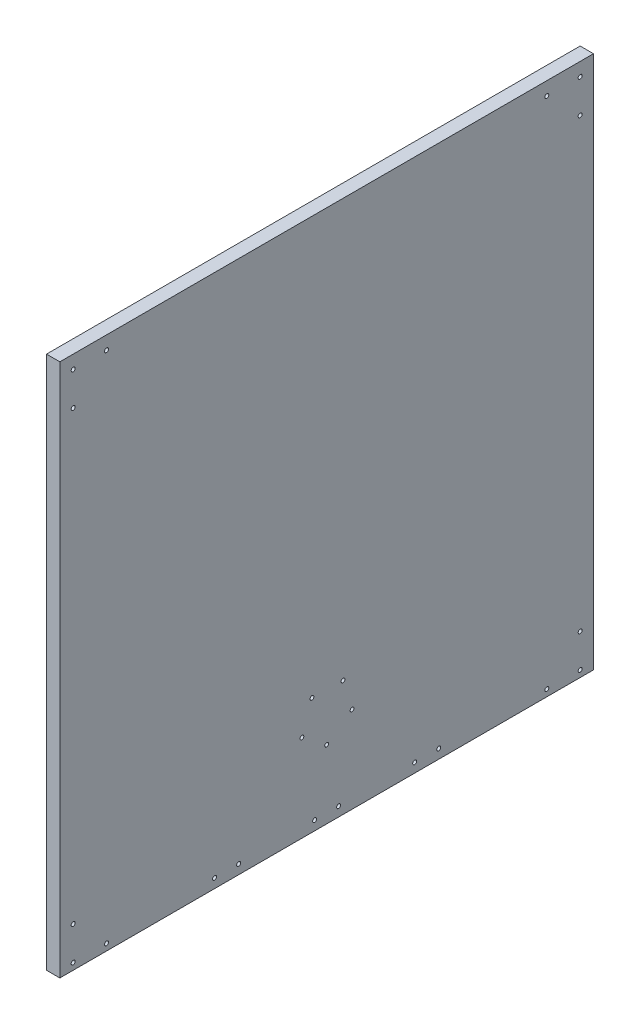
ISO-10303-21;
HEADER;
FILE_DESCRIPTION(('STEP AP214'),'2;1');
FILE_NAME('part.step','',(''),(''),'','','');
FILE_SCHEMA(('AUTOMOTIVE_DESIGN { 1 0 10303 214 1 1 1 1 }'));
ENDSEC;
DATA;
#1=APPLICATION_CONTEXT('core data for automotive mechanical design processes');
#2=APPLICATION_PROTOCOL_DEFINITION('international standard','automotive_design',2000,#1);
#3=PRODUCT_CONTEXT('',#1,'mechanical');
#4=PRODUCT('Part','Part','',(#3));
#5=PRODUCT_RELATED_PRODUCT_CATEGORY('part','',(#4));
#6=PRODUCT_DEFINITION_FORMATION('','',#4);
#7=PRODUCT_DEFINITION_CONTEXT('part definition',#1,'design');
#8=PRODUCT_DEFINITION('design','',#6,#7);
#9=PRODUCT_DEFINITION_SHAPE('','',#8);
#10=(LENGTH_UNIT() NAMED_UNIT(*) SI_UNIT(.MILLI.,.METRE.));
#11=(NAMED_UNIT(*) PLANE_ANGLE_UNIT() SI_UNIT($,.RADIAN.));
#12=(NAMED_UNIT(*) SI_UNIT($,.STERADIAN.) SOLID_ANGLE_UNIT());
#13=UNCERTAINTY_MEASURE_WITH_UNIT(LENGTH_MEASURE(1.E-05),#10,'distance_accuracy_value','');
#14=(GEOMETRIC_REPRESENTATION_CONTEXT(3) GLOBAL_UNCERTAINTY_ASSIGNED_CONTEXT((#13)) GLOBAL_UNIT_ASSIGNED_CONTEXT((#10,
#11,#12)) REPRESENTATION_CONTEXT('',''));
#15=CARTESIAN_POINT('',(0.,0.,0.));
#16=DIRECTION('',(0.,0.,1.));
#17=DIRECTION('',(1.,0.,0.));
#18=AXIS2_PLACEMENT_3D('',#15,#16,#17);
#19=CARTESIAN_POINT('',(10.,0.,-200.));
#20=DIRECTION('',(0.,0.,-1.));
#21=DIRECTION('',(0.,1.,0.));
#22=AXIS2_PLACEMENT_3D('',#19,#20,#21);
#23=PLANE('',#22);
#24=DIRECTION('',(0.,-1.,0.));
#25=VECTOR('',#24,1.);
#26=CARTESIAN_POINT('',(0.,0.,-200.));
#27=LINE('',#26,#25);
#28=CARTESIAN_POINT('',(0.,200.,-200.));
#29=VERTEX_POINT('',#28);
#30=CARTESIAN_POINT('',(0.,-200.,-200.));
#31=VERTEX_POINT('',#30);
#32=EDGE_CURVE('E100',#29,#31,#27,.T.);
#33=ORIENTED_EDGE('',*,*,#32,.F.);
#34=DIRECTION('',(-1.,0.,0.));
#35=VECTOR('',#34,1.);
#36=CARTESIAN_POINT('',(10.,200.,-200.));
#37=LINE('',#36,#35);
#38=CARTESIAN_POINT('',(10.,200.,-200.));
#39=VERTEX_POINT('',#38);
#40=EDGE_CURVE('E11',#39,#29,#37,.T.);
#41=ORIENTED_EDGE('',*,*,#40,.F.);
#42=DIRECTION('',(0.,-1.,0.));
#43=VECTOR('',#42,1.);
#44=CARTESIAN_POINT('',(10.,0.,-200.));
#45=LINE('',#44,#43);
#46=CARTESIAN_POINT('',(10.,-200.,-200.));
#47=VERTEX_POINT('',#46);
#48=EDGE_CURVE('E93',#39,#47,#45,.T.);
#49=ORIENTED_EDGE('',*,*,#48,.T.);
#50=DIRECTION('',(-1.,0.,0.));
#51=VECTOR('',#50,1.);
#52=CARTESIAN_POINT('',(10.,-200.,-200.));
#53=LINE('',#52,#51);
#54=EDGE_CURVE('E74',#47,#31,#53,.T.);
#55=ORIENTED_EDGE('',*,*,#54,.T.);
#56=EDGE_LOOP('',(#33,#41,#49,#55));
#57=FACE_BOUND('',#56,.T.);
#58=ADVANCED_FACE('F36',(#57),#23,.T.);
#59=CARTESIAN_POINT('',(10.,200.,0.));
#60=DIRECTION('',(0.,1.,0.));
#61=DIRECTION('',(0.,0.,1.));
#62=AXIS2_PLACEMENT_3D('',#59,#60,#61);
#63=PLANE('',#62);
#64=DIRECTION('',(0.,0.,-1.));
#65=VECTOR('',#64,1.);
#66=CARTESIAN_POINT('',(0.,200.,0.));
#67=LINE('',#66,#65);
#68=CARTESIAN_POINT('',(0.,200.,200.));
#69=VERTEX_POINT('',#68);
#70=EDGE_CURVE('E87',#69,#29,#67,.T.);
#71=ORIENTED_EDGE('',*,*,#70,.F.);
#72=DIRECTION('',(-1.,0.,0.));
#73=VECTOR('',#72,1.);
#74=CARTESIAN_POINT('',(10.,200.,200.));
#75=LINE('',#74,#73);
#76=CARTESIAN_POINT('',(10.,200.,200.));
#77=VERTEX_POINT('',#76);
#78=EDGE_CURVE('E44',#77,#69,#75,.T.);
#79=ORIENTED_EDGE('',*,*,#78,.F.);
#80=DIRECTION('',(0.,0.,-1.));
#81=VECTOR('',#80,1.);
#82=CARTESIAN_POINT('',(10.,200.,0.));
#83=LINE('',#82,#81);
#84=EDGE_CURVE('E85',#77,#39,#83,.T.);
#85=ORIENTED_EDGE('',*,*,#84,.T.);
#86=ORIENTED_EDGE('',*,*,#40,.T.);
#87=EDGE_LOOP('',(#71,#79,#85,#86));
#88=FACE_BOUND('',#87,.T.);
#89=ADVANCED_FACE('F83',(#88),#63,.T.);
#90=CARTESIAN_POINT('',(10.,0.,200.));
#91=DIRECTION('',(0.,0.,-1.));
#92=DIRECTION('',(0.,1.,0.));
#93=AXIS2_PLACEMENT_3D('',#90,#91,#92);
#94=PLANE('',#93);
#95=DIRECTION('',(0.,-1.,0.));
#96=VECTOR('',#95,1.);
#97=CARTESIAN_POINT('',(0.,0.,200.));
#98=LINE('',#97,#96);
#99=CARTESIAN_POINT('',(0.,-200.,200.));
#100=VERTEX_POINT('',#99);
#101=EDGE_CURVE('E67',#69,#100,#98,.T.);
#102=ORIENTED_EDGE('',*,*,#101,.T.);
#103=DIRECTION('',(-1.,0.,0.));
#104=VECTOR('',#103,1.);
#105=CARTESIAN_POINT('',(10.,-200.,200.));
#106=LINE('',#105,#104);
#107=CARTESIAN_POINT('',(10.,-200.,200.));
#108=VERTEX_POINT('',#107);
#109=EDGE_CURVE('E88',#108,#100,#106,.T.);
#110=ORIENTED_EDGE('',*,*,#109,.F.);
#111=DIRECTION('',(0.,-1.,0.));
#112=VECTOR('',#111,1.);
#113=CARTESIAN_POINT('',(10.,0.,200.));
#114=LINE('',#113,#112);
#115=EDGE_CURVE('E89',#77,#108,#114,.T.);
#116=ORIENTED_EDGE('',*,*,#115,.F.);
#117=ORIENTED_EDGE('',*,*,#78,.T.);
#118=EDGE_LOOP('',(#102,#110,#116,#117));
#119=FACE_BOUND('',#118,.T.);
#120=ADVANCED_FACE('F90',(#119),#94,.F.);
#121=CARTESIAN_POINT('',(10.,-200.,0.));
#122=DIRECTION('',(0.,1.,0.));
#123=DIRECTION('',(0.,0.,1.));
#124=AXIS2_PLACEMENT_3D('',#121,#122,#123);
#125=PLANE('',#124);
#126=DIRECTION('',(0.,0.,-1.));
#127=VECTOR('',#126,1.);
#128=CARTESIAN_POINT('',(0.,-200.,0.));
#129=LINE('',#128,#127);
#130=EDGE_CURVE('E95',#100,#31,#129,.T.);
#131=ORIENTED_EDGE('',*,*,#130,.T.);
#132=ORIENTED_EDGE('',*,*,#54,.F.);
#133=DIRECTION('',(0.,0.,-1.));
#134=VECTOR('',#133,1.);
#135=CARTESIAN_POINT('',(10.,-200.,0.));
#136=LINE('',#135,#134);
#137=EDGE_CURVE('E52',#108,#47,#136,.T.);
#138=ORIENTED_EDGE('',*,*,#137,.F.);
#139=ORIENTED_EDGE('',*,*,#109,.T.);
#140=EDGE_LOOP('',(#131,#132,#138,#139));
#141=FACE_BOUND('',#140,.T.);
#142=ADVANCED_FACE('F110',(#141),#125,.F.);
#143=CARTESIAN_POINT('',(10.,0.,0.));
#144=DIRECTION('',(1.,0.,0.));
#145=DIRECTION('',(0.,0.,-1.));
#146=AXIS2_PLACEMENT_3D('',#143,#144,#145);
#147=PLANE('',#146);
#148=CARTESIAN_POINT('',(10.,-113.022211572453,-12.2380282533939));
#149=DIRECTION('',(1.,0.,0.));
#150=DIRECTION('',(0.,0.,-1.));
#151=AXIS2_PLACEMENT_3D('',#148,#149,#150);
#152=CIRCLE('',#151,1.45000000000002);
#153=CARTESIAN_POINT('',(10.,-113.022211572453,-13.6880282533939));
#154=VERTEX_POINT('',#153);
#155=EDGE_CURVE('E245',#154,#154,#152,.T.);
#156=ORIENTED_EDGE('',*,*,#155,.F.);
#157=EDGE_LOOP('',(#156));
#158=FACE_BOUND('',#157,.T.);
#159=CARTESIAN_POINT('',(10.,-134.607193772722,18.571414113098));
#160=DIRECTION('',(1.,0.,0.));
#161=DIRECTION('',(0.,0.,-1.));
#162=AXIS2_PLACEMENT_3D('',#159,#160,#161);
#163=CIRCLE('',#162,1.44999999999999);
#164=CARTESIAN_POINT('',(10.,-134.607193772722,17.121414113098));
#165=VERTEX_POINT('',#164);
#166=EDGE_CURVE('E233',#165,#165,#163,.T.);
#167=ORIENTED_EDGE('',*,*,#166,.F.);
#168=EDGE_LOOP('',(#167));
#169=FACE_BOUND('',#168,.T.);
#170=CARTESIAN_POINT('',(10.,-135.253912203802,-19.0412825569231));
#171=DIRECTION('',(1.,0.,0.));
#172=DIRECTION('',(0.,0.,-1.));
#173=AXIS2_PLACEMENT_3D('',#170,#171,#172);
#174=CIRCLE('',#173,1.44999999999997);
#175=CARTESIAN_POINT('',(10.,-135.253912203802,-20.491282556923));
#176=VERTEX_POINT('',#175);
#177=EDGE_CURVE('E229',#176,#176,#174,.T.);
#178=ORIENTED_EDGE('',*,*,#177,.F.);
#179=EDGE_LOOP('',(#178));
#180=FACE_BOUND('',#179,.T.);
#181=CARTESIAN_POINT('',(10.,-148.59416485013,0.));
#182=DIRECTION('',(1.,0.,0.));
#183=DIRECTION('',(0.,0.,-1.));
#184=AXIS2_PLACEMENT_3D('',#181,#182,#183);
#185=CIRCLE('',#184,1.44999999999995);
#186=CARTESIAN_POINT('',(10.,-148.59416485013,-1.45000000000003));
#187=VERTEX_POINT('',#186);
#188=EDGE_CURVE('E236',#187,#187,#185,.T.);
#189=ORIENTED_EDGE('',*,*,#188,.F.);
#190=EDGE_LOOP('',(#189));
#191=FACE_BOUND('',#190,.T.);
#192=CARTESIAN_POINT('',(10.,-112.622517600894,11.0078966972191));
#193=DIRECTION('',(1.,0.,0.));
#194=DIRECTION('',(0.,0.,-1.));
#195=AXIS2_PLACEMENT_3D('',#192,#193,#194);
#196=CIRCLE('',#195,1.45000000000004);
#197=CARTESIAN_POINT('',(10.,-112.622517600894,9.55789669721902));
#198=VERTEX_POINT('',#197);
#199=EDGE_CURVE('E244',#198,#198,#196,.T.);
#200=ORIENTED_EDGE('',*,*,#199,.F.);
#201=EDGE_LOOP('',(#200));
#202=FACE_BOUND('',#201,.T.);
#203=CARTESIAN_POINT('',(10.,190.,165.));
#204=DIRECTION('',(-1.,0.,0.));
#205=DIRECTION('',(0.,0.,1.));
#206=AXIS2_PLACEMENT_3D('',#203,#204,#205);
#207=CIRCLE('',#206,1.5);
#208=CARTESIAN_POINT('',(10.,190.,166.5));
#209=VERTEX_POINT('',#208);
#210=EDGE_CURVE('E269',#209,#209,#207,.T.);
#211=ORIENTED_EDGE('',*,*,#210,.T.);
#212=EDGE_LOOP('',(#211));
#213=FACE_BOUND('',#212,.T.);
#214=CARTESIAN_POINT('',(10.,165.,190.));
#215=DIRECTION('',(-1.,0.,0.));
#216=DIRECTION('',(0.,0.,1.));
#217=AXIS2_PLACEMENT_3D('',#214,#215,#216);
#218=CIRCLE('',#217,1.5);
#219=CARTESIAN_POINT('',(10.,165.,191.5));
#220=VERTEX_POINT('',#219);
#221=EDGE_CURVE('E275',#220,#220,#218,.T.);
#222=ORIENTED_EDGE('',*,*,#221,.T.);
#223=EDGE_LOOP('',(#222));
#224=FACE_BOUND('',#223,.T.);
#225=CARTESIAN_POINT('',(10.,-195.,190.));
#226=DIRECTION('',(-1.,0.,0.));
#227=DIRECTION('',(0.,0.,1.));
#228=AXIS2_PLACEMENT_3D('',#225,#226,#227);
#229=CIRCLE('',#228,1.5);
#230=CARTESIAN_POINT('',(10.,-195.,191.5));
#231=VERTEX_POINT('',#230);
#232=EDGE_CURVE('E281',#231,#231,#229,.T.);
#233=ORIENTED_EDGE('',*,*,#232,.T.);
#234=EDGE_LOOP('',(#233));
#235=FACE_BOUND('',#234,.T.);
#236=CARTESIAN_POINT('',(10.,-195.,165.));
#237=DIRECTION('',(-1.,0.,0.));
#238=DIRECTION('',(0.,0.,1.));
#239=AXIS2_PLACEMENT_3D('',#236,#237,#238);
#240=CIRCLE('',#239,1.5);
#241=CARTESIAN_POINT('',(10.,-195.,166.5));
#242=VERTEX_POINT('',#241);
#243=EDGE_CURVE('E262',#242,#242,#240,.T.);
#244=ORIENTED_EDGE('',*,*,#243,.T.);
#245=EDGE_LOOP('',(#244));
#246=FACE_BOUND('',#245,.T.);
#247=CARTESIAN_POINT('',(10.,-170.,190.));
#248=DIRECTION('',(-1.,0.,0.));
#249=DIRECTION('',(0.,0.,1.));
#250=AXIS2_PLACEMENT_3D('',#247,#248,#249);
#251=CIRCLE('',#250,1.5);
#252=CARTESIAN_POINT('',(10.,-170.,191.5));
#253=VERTEX_POINT('',#252);
#254=EDGE_CURVE('E256',#253,#253,#251,.T.);
#255=ORIENTED_EDGE('',*,*,#254,.T.);
#256=EDGE_LOOP('',(#255));
#257=FACE_BOUND('',#256,.T.);
#258=CARTESIAN_POINT('',(10.,190.,190.));
#259=DIRECTION('',(-1.,0.,0.));
#260=DIRECTION('',(0.,0.,1.));
#261=AXIS2_PLACEMENT_3D('',#258,#259,#260);
#262=CIRCLE('',#261,1.5);
#263=CARTESIAN_POINT('',(10.,190.,191.5));
#264=VERTEX_POINT('',#263);
#265=EDGE_CURVE('E268',#264,#264,#262,.T.);
#266=ORIENTED_EDGE('',*,*,#265,.T.);
#267=EDGE_LOOP('',(#266));
#268=FACE_BOUND('',#267,.T.);
#269=CARTESIAN_POINT('',(10.,-193.,84.));
#270=DIRECTION('',(1.,0.,0.));
#271=DIRECTION('',(0.,0.,-1.));
#272=AXIS2_PLACEMENT_3D('',#269,#270,#271);
#273=CIRCLE('',#272,1.5);
#274=CARTESIAN_POINT('',(10.,-193.,82.5));
#275=VERTEX_POINT('',#274);
#276=EDGE_CURVE('E299',#275,#275,#273,.T.);
#277=ORIENTED_EDGE('',*,*,#276,.F.);
#278=EDGE_LOOP('',(#277));
#279=FACE_BOUND('',#278,.T.);
#280=CARTESIAN_POINT('',(10.,-193.,66.));
#281=DIRECTION('',(1.,0.,0.));
#282=DIRECTION('',(0.,0.,-1.));
#283=AXIS2_PLACEMENT_3D('',#280,#281,#282);
#284=CIRCLE('',#283,1.5);
#285=CARTESIAN_POINT('',(10.,-193.,64.5));
#286=VERTEX_POINT('',#285);
#287=EDGE_CURVE('E305',#286,#286,#284,.T.);
#288=ORIENTED_EDGE('',*,*,#287,.F.);
#289=EDGE_LOOP('',(#288));
#290=FACE_BOUND('',#289,.T.);
#291=CARTESIAN_POINT('',(10.,-193.,9.));
#292=DIRECTION('',(1.,0.,0.));
#293=DIRECTION('',(0.,0.,-1.));
#294=AXIS2_PLACEMENT_3D('',#291,#292,#293);
#295=CIRCLE('',#294,1.5);
#296=CARTESIAN_POINT('',(10.,-193.,7.5));
#297=VERTEX_POINT('',#296);
#298=EDGE_CURVE('E311',#297,#297,#295,.T.);
#299=ORIENTED_EDGE('',*,*,#298,.F.);
#300=EDGE_LOOP('',(#299));
#301=FACE_BOUND('',#300,.T.);
#302=CARTESIAN_POINT('',(10.,-193.,-9.));
#303=DIRECTION('',(1.,0.,0.));
#304=DIRECTION('',(0.,0.,-1.));
#305=AXIS2_PLACEMENT_3D('',#302,#303,#304);
#306=CIRCLE('',#305,1.5);
#307=CARTESIAN_POINT('',(10.,-193.,-10.5));
#308=VERTEX_POINT('',#307);
#309=EDGE_CURVE('E317',#308,#308,#306,.T.);
#310=ORIENTED_EDGE('',*,*,#309,.F.);
#311=EDGE_LOOP('',(#310));
#312=FACE_BOUND('',#311,.T.);
#313=CARTESIAN_POINT('',(10.,-193.,-66.));
#314=DIRECTION('',(1.,0.,0.));
#315=DIRECTION('',(0.,0.,-1.));
#316=AXIS2_PLACEMENT_3D('',#313,#314,#315);
#317=CIRCLE('',#316,1.5);
#318=CARTESIAN_POINT('',(10.,-193.,-67.5));
#319=VERTEX_POINT('',#318);
#320=EDGE_CURVE('E323',#319,#319,#317,.T.);
#321=ORIENTED_EDGE('',*,*,#320,.F.);
#322=EDGE_LOOP('',(#321));
#323=FACE_BOUND('',#322,.T.);
#324=CARTESIAN_POINT('',(10.,-193.,-84.));
#325=DIRECTION('',(1.,0.,0.));
#326=DIRECTION('',(0.,0.,-1.));
#327=AXIS2_PLACEMENT_3D('',#324,#325,#326);
#328=CIRCLE('',#327,1.5);
#329=CARTESIAN_POINT('',(10.,-193.,-85.5));
#330=VERTEX_POINT('',#329);
#331=EDGE_CURVE('E292',#330,#330,#328,.T.);
#332=ORIENTED_EDGE('',*,*,#331,.F.);
#333=EDGE_LOOP('',(#332));
#334=FACE_BOUND('',#333,.T.);
#335=CARTESIAN_POINT('',(10.,190.,-165.));
#336=DIRECTION('',(1.,0.,0.));
#337=DIRECTION('',(0.,0.,-1.));
#338=AXIS2_PLACEMENT_3D('',#335,#336,#337);
#339=CIRCLE('',#338,1.5);
#340=CARTESIAN_POINT('',(10.,190.,-166.5));
#341=VERTEX_POINT('',#340);
#342=EDGE_CURVE('E341',#341,#341,#339,.T.);
#343=ORIENTED_EDGE('',*,*,#342,.F.);
#344=EDGE_LOOP('',(#343));
#345=FACE_BOUND('',#344,.T.);
#346=CARTESIAN_POINT('',(10.,165.,-190.));
#347=DIRECTION('',(1.,0.,0.));
#348=DIRECTION('',(0.,0.,-1.));
#349=AXIS2_PLACEMENT_3D('',#346,#347,#348);
#350=CIRCLE('',#349,1.5);
#351=CARTESIAN_POINT('',(10.,165.,-191.5));
#352=VERTEX_POINT('',#351);
#353=EDGE_CURVE('E347',#352,#352,#350,.T.);
#354=ORIENTED_EDGE('',*,*,#353,.F.);
#355=EDGE_LOOP('',(#354));
#356=FACE_BOUND('',#355,.T.);
#357=CARTESIAN_POINT('',(10.,-195.,-190.));
#358=DIRECTION('',(1.,0.,0.));
#359=DIRECTION('',(0.,0.,-1.));
#360=AXIS2_PLACEMENT_3D('',#357,#358,#359);
#361=CIRCLE('',#360,1.5);
#362=CARTESIAN_POINT('',(10.,-195.,-191.5));
#363=VERTEX_POINT('',#362);
#364=EDGE_CURVE('E353',#363,#363,#361,.T.);
#365=ORIENTED_EDGE('',*,*,#364,.F.);
#366=EDGE_LOOP('',(#365));
#367=FACE_BOUND('',#366,.T.);
#368=CARTESIAN_POINT('',(10.,-195.,-165.));
#369=DIRECTION('',(1.,0.,0.));
#370=DIRECTION('',(0.,0.,-1.));
#371=AXIS2_PLACEMENT_3D('',#368,#369,#370);
#372=CIRCLE('',#371,1.5);
#373=CARTESIAN_POINT('',(10.,-195.,-166.5));
#374=VERTEX_POINT('',#373);
#375=EDGE_CURVE('E334',#374,#374,#372,.T.);
#376=ORIENTED_EDGE('',*,*,#375,.F.);
#377=EDGE_LOOP('',(#376));
#378=FACE_BOUND('',#377,.T.);
#379=CARTESIAN_POINT('',(10.,-170.,-190.));
#380=DIRECTION('',(1.,0.,0.));
#381=DIRECTION('',(0.,0.,-1.));
#382=AXIS2_PLACEMENT_3D('',#379,#380,#381);
#383=CIRCLE('',#382,1.5);
#384=CARTESIAN_POINT('',(10.,-170.,-191.5));
#385=VERTEX_POINT('',#384);
#386=EDGE_CURVE('E298',#385,#385,#383,.T.);
#387=ORIENTED_EDGE('',*,*,#386,.F.);
#388=EDGE_LOOP('',(#387));
#389=FACE_BOUND('',#388,.T.);
#390=CARTESIAN_POINT('',(10.,190.,-190.));
#391=DIRECTION('',(1.,0.,0.));
#392=DIRECTION('',(0.,0.,-1.));
#393=AXIS2_PLACEMENT_3D('',#390,#391,#392);
#394=CIRCLE('',#393,1.5);
#395=CARTESIAN_POINT('',(10.,190.,-191.5));
#396=VERTEX_POINT('',#395);
#397=EDGE_CURVE('E340',#396,#396,#394,.T.);
#398=ORIENTED_EDGE('',*,*,#397,.F.);
#399=EDGE_LOOP('',(#398));
#400=FACE_BOUND('',#399,.T.);
#401=ORIENTED_EDGE('',*,*,#48,.F.);
#402=ORIENTED_EDGE('',*,*,#84,.F.);
#403=ORIENTED_EDGE('',*,*,#115,.T.);
#404=ORIENTED_EDGE('',*,*,#137,.T.);
#405=EDGE_LOOP('',(#401,#402,#403,#404));
#406=FACE_BOUND('',#405,.T.);
#407=ADVANCED_FACE('F92',(#158,#169,#180,#191,#202,#213,#224,#235,#246,#257,#268,#279,#290,#301,
#312,#323,#334,#345,#356,#367,#378,#389,#400,#406),#147,.T.);
#408=CARTESIAN_POINT('',(0.,0.,0.));
#409=DIRECTION('',(1.,0.,0.));
#410=DIRECTION('',(0.,0.,-1.));
#411=AXIS2_PLACEMENT_3D('',#408,#409,#410);
#412=PLANE('',#411);
#413=CARTESIAN_POINT('',(0.,-113.022211572453,-12.2380282533939));
#414=DIRECTION('',(1.,0.,0.));
#415=DIRECTION('',(0.,0.,-1.));
#416=AXIS2_PLACEMENT_3D('',#413,#414,#415);
#417=CIRCLE('',#416,1.45000000000002);
#418=CARTESIAN_POINT('',(0.,-113.022211572453,-13.6880282533939));
#419=VERTEX_POINT('',#418);
#420=EDGE_CURVE('E241',#419,#419,#417,.T.);
#421=ORIENTED_EDGE('',*,*,#420,.T.);
#422=EDGE_LOOP('',(#421));
#423=FACE_BOUND('',#422,.T.);
#424=CARTESIAN_POINT('',(0.,-134.607193772722,18.571414113098));
#425=DIRECTION('',(1.,0.,0.));
#426=DIRECTION('',(0.,0.,-1.));
#427=AXIS2_PLACEMENT_3D('',#424,#425,#426);
#428=CIRCLE('',#427,1.44999999999999);
#429=CARTESIAN_POINT('',(0.,-134.607193772722,17.121414113098));
#430=VERTEX_POINT('',#429);
#431=EDGE_CURVE('E248',#430,#430,#428,.T.);
#432=ORIENTED_EDGE('',*,*,#431,.T.);
#433=EDGE_LOOP('',(#432));
#434=FACE_BOUND('',#433,.T.);
#435=CARTESIAN_POINT('',(0.,-135.253912203802,-19.0412825569231));
#436=DIRECTION('',(1.,0.,0.));
#437=DIRECTION('',(0.,0.,-1.));
#438=AXIS2_PLACEMENT_3D('',#435,#436,#437);
#439=CIRCLE('',#438,1.44999999999997);
#440=CARTESIAN_POINT('',(0.,-135.253912203802,-20.491282556923));
#441=VERTEX_POINT('',#440);
#442=EDGE_CURVE('E226',#441,#441,#439,.T.);
#443=ORIENTED_EDGE('',*,*,#442,.T.);
#444=EDGE_LOOP('',(#443));
#445=FACE_BOUND('',#444,.T.);
#446=CARTESIAN_POINT('',(0.,-148.59416485013,0.));
#447=DIRECTION('',(1.,0.,0.));
#448=DIRECTION('',(0.,0.,-1.));
#449=AXIS2_PLACEMENT_3D('',#446,#447,#448);
#450=CIRCLE('',#449,1.44999999999995);
#451=CARTESIAN_POINT('',(0.,-148.59416485013,-1.45000000000003));
#452=VERTEX_POINT('',#451);
#453=EDGE_CURVE('E231',#452,#452,#450,.T.);
#454=ORIENTED_EDGE('',*,*,#453,.T.);
#455=EDGE_LOOP('',(#454));
#456=FACE_BOUND('',#455,.T.);
#457=CARTESIAN_POINT('',(0.,-112.622517600894,11.0078966972191));
#458=DIRECTION('',(1.,0.,0.));
#459=DIRECTION('',(0.,0.,-1.));
#460=AXIS2_PLACEMENT_3D('',#457,#458,#459);
#461=CIRCLE('',#460,1.45000000000004);
#462=CARTESIAN_POINT('',(0.,-112.622517600894,9.55789669721902));
#463=VERTEX_POINT('',#462);
#464=EDGE_CURVE('E253',#463,#463,#461,.T.);
#465=ORIENTED_EDGE('',*,*,#464,.T.);
#466=EDGE_LOOP('',(#465));
#467=FACE_BOUND('',#466,.T.);
#468=CARTESIAN_POINT('',(0.,190.,165.));
#469=DIRECTION('',(-1.,0.,0.));
#470=DIRECTION('',(0.,0.,1.));
#471=AXIS2_PLACEMENT_3D('',#468,#469,#470);
#472=CIRCLE('',#471,1.5);
#473=CARTESIAN_POINT('',(0.,190.,166.5));
#474=VERTEX_POINT('',#473);
#475=EDGE_CURVE('E265',#474,#474,#472,.T.);
#476=ORIENTED_EDGE('',*,*,#475,.F.);
#477=EDGE_LOOP('',(#476));
#478=FACE_BOUND('',#477,.T.);
#479=CARTESIAN_POINT('',(0.,165.,190.));
#480=DIRECTION('',(-1.,0.,0.));
#481=DIRECTION('',(0.,0.,1.));
#482=AXIS2_PLACEMENT_3D('',#479,#480,#481);
#483=CIRCLE('',#482,1.5);
#484=CARTESIAN_POINT('',(0.,165.,191.5));
#485=VERTEX_POINT('',#484);
#486=EDGE_CURVE('E272',#485,#485,#483,.T.);
#487=ORIENTED_EDGE('',*,*,#486,.F.);
#488=EDGE_LOOP('',(#487));
#489=FACE_BOUND('',#488,.T.);
#490=CARTESIAN_POINT('',(0.,-195.,190.));
#491=DIRECTION('',(-1.,0.,0.));
#492=DIRECTION('',(0.,0.,1.));
#493=AXIS2_PLACEMENT_3D('',#490,#491,#492);
#494=CIRCLE('',#493,1.5);
#495=CARTESIAN_POINT('',(0.,-195.,191.5));
#496=VERTEX_POINT('',#495);
#497=EDGE_CURVE('E278',#496,#496,#494,.T.);
#498=ORIENTED_EDGE('',*,*,#497,.F.);
#499=EDGE_LOOP('',(#498));
#500=FACE_BOUND('',#499,.T.);
#501=CARTESIAN_POINT('',(0.,-195.,165.));
#502=DIRECTION('',(-1.,0.,0.));
#503=DIRECTION('',(0.,0.,1.));
#504=AXIS2_PLACEMENT_3D('',#501,#502,#503);
#505=CIRCLE('',#504,1.5);
#506=CARTESIAN_POINT('',(0.,-195.,166.5));
#507=VERTEX_POINT('',#506);
#508=EDGE_CURVE('E284',#507,#507,#505,.T.);
#509=ORIENTED_EDGE('',*,*,#508,.F.);
#510=EDGE_LOOP('',(#509));
#511=FACE_BOUND('',#510,.T.);
#512=CARTESIAN_POINT('',(0.,-170.,190.));
#513=DIRECTION('',(-1.,0.,0.));
#514=DIRECTION('',(0.,0.,1.));
#515=AXIS2_PLACEMENT_3D('',#512,#513,#514);
#516=CIRCLE('',#515,1.5);
#517=CARTESIAN_POINT('',(0.,-170.,191.5));
#518=VERTEX_POINT('',#517);
#519=EDGE_CURVE('E259',#518,#518,#516,.T.);
#520=ORIENTED_EDGE('',*,*,#519,.F.);
#521=EDGE_LOOP('',(#520));
#522=FACE_BOUND('',#521,.T.);
#523=CARTESIAN_POINT('',(0.,190.,190.));
#524=DIRECTION('',(-1.,0.,0.));
#525=DIRECTION('',(0.,0.,1.));
#526=AXIS2_PLACEMENT_3D('',#523,#524,#525);
#527=CIRCLE('',#526,1.5);
#528=CARTESIAN_POINT('',(0.,190.,191.5));
#529=VERTEX_POINT('',#528);
#530=EDGE_CURVE('E289',#529,#529,#527,.T.);
#531=ORIENTED_EDGE('',*,*,#530,.F.);
#532=EDGE_LOOP('',(#531));
#533=FACE_BOUND('',#532,.T.);
#534=CARTESIAN_POINT('',(0.,-193.,84.));
#535=DIRECTION('',(1.,0.,0.));
#536=DIRECTION('',(0.,0.,-1.));
#537=AXIS2_PLACEMENT_3D('',#534,#535,#536);
#538=CIRCLE('',#537,1.5);
#539=CARTESIAN_POINT('',(0.,-193.,82.5));
#540=VERTEX_POINT('',#539);
#541=EDGE_CURVE('E295',#540,#540,#538,.T.);
#542=ORIENTED_EDGE('',*,*,#541,.T.);
#543=EDGE_LOOP('',(#542));
#544=FACE_BOUND('',#543,.T.);
#545=CARTESIAN_POINT('',(0.,-193.,66.));
#546=DIRECTION('',(1.,0.,0.));
#547=DIRECTION('',(0.,0.,-1.));
#548=AXIS2_PLACEMENT_3D('',#545,#546,#547);
#549=CIRCLE('',#548,1.5);
#550=CARTESIAN_POINT('',(0.,-193.,64.5));
#551=VERTEX_POINT('',#550);
#552=EDGE_CURVE('E302',#551,#551,#549,.T.);
#553=ORIENTED_EDGE('',*,*,#552,.T.);
#554=EDGE_LOOP('',(#553));
#555=FACE_BOUND('',#554,.T.);
#556=CARTESIAN_POINT('',(0.,-193.,9.));
#557=DIRECTION('',(1.,0.,0.));
#558=DIRECTION('',(0.,0.,-1.));
#559=AXIS2_PLACEMENT_3D('',#556,#557,#558);
#560=CIRCLE('',#559,1.5);
#561=CARTESIAN_POINT('',(0.,-193.,7.5));
#562=VERTEX_POINT('',#561);
#563=EDGE_CURVE('E308',#562,#562,#560,.T.);
#564=ORIENTED_EDGE('',*,*,#563,.T.);
#565=EDGE_LOOP('',(#564));
#566=FACE_BOUND('',#565,.T.);
#567=CARTESIAN_POINT('',(0.,-193.,-9.));
#568=DIRECTION('',(1.,0.,0.));
#569=DIRECTION('',(0.,0.,-1.));
#570=AXIS2_PLACEMENT_3D('',#567,#568,#569);
#571=CIRCLE('',#570,1.5);
#572=CARTESIAN_POINT('',(0.,-193.,-10.5));
#573=VERTEX_POINT('',#572);
#574=EDGE_CURVE('E314',#573,#573,#571,.T.);
#575=ORIENTED_EDGE('',*,*,#574,.T.);
#576=EDGE_LOOP('',(#575));
#577=FACE_BOUND('',#576,.T.);
#578=CARTESIAN_POINT('',(0.,-193.,-66.));
#579=DIRECTION('',(1.,0.,0.));
#580=DIRECTION('',(0.,0.,-1.));
#581=AXIS2_PLACEMENT_3D('',#578,#579,#580);
#582=CIRCLE('',#581,1.5);
#583=CARTESIAN_POINT('',(0.,-193.,-67.5));
#584=VERTEX_POINT('',#583);
#585=EDGE_CURVE('E320',#584,#584,#582,.T.);
#586=ORIENTED_EDGE('',*,*,#585,.T.);
#587=EDGE_LOOP('',(#586));
#588=FACE_BOUND('',#587,.T.);
#589=CARTESIAN_POINT('',(0.,-193.,-84.));
#590=DIRECTION('',(1.,0.,0.));
#591=DIRECTION('',(0.,0.,-1.));
#592=AXIS2_PLACEMENT_3D('',#589,#590,#591);
#593=CIRCLE('',#592,1.5);
#594=CARTESIAN_POINT('',(0.,-193.,-85.5));
#595=VERTEX_POINT('',#594);
#596=EDGE_CURVE('E326',#595,#595,#593,.T.);
#597=ORIENTED_EDGE('',*,*,#596,.T.);
#598=EDGE_LOOP('',(#597));
#599=FACE_BOUND('',#598,.T.);
#600=CARTESIAN_POINT('',(0.,190.,-165.));
#601=DIRECTION('',(1.,0.,0.));
#602=DIRECTION('',(0.,0.,-1.));
#603=AXIS2_PLACEMENT_3D('',#600,#601,#602);
#604=CIRCLE('',#603,1.5);
#605=CARTESIAN_POINT('',(0.,190.,-166.5));
#606=VERTEX_POINT('',#605);
#607=EDGE_CURVE('E337',#606,#606,#604,.T.);
#608=ORIENTED_EDGE('',*,*,#607,.T.);
#609=EDGE_LOOP('',(#608));
#610=FACE_BOUND('',#609,.T.);
#611=CARTESIAN_POINT('',(0.,165.,-190.));
#612=DIRECTION('',(1.,0.,0.));
#613=DIRECTION('',(0.,0.,-1.));
#614=AXIS2_PLACEMENT_3D('',#611,#612,#613);
#615=CIRCLE('',#614,1.5);
#616=CARTESIAN_POINT('',(0.,165.,-191.5));
#617=VERTEX_POINT('',#616);
#618=EDGE_CURVE('E344',#617,#617,#615,.T.);
#619=ORIENTED_EDGE('',*,*,#618,.T.);
#620=EDGE_LOOP('',(#619));
#621=FACE_BOUND('',#620,.T.);
#622=CARTESIAN_POINT('',(0.,-195.,-190.));
#623=DIRECTION('',(1.,0.,0.));
#624=DIRECTION('',(0.,0.,-1.));
#625=AXIS2_PLACEMENT_3D('',#622,#623,#624);
#626=CIRCLE('',#625,1.5);
#627=CARTESIAN_POINT('',(0.,-195.,-191.5));
#628=VERTEX_POINT('',#627);
#629=EDGE_CURVE('E350',#628,#628,#626,.T.);
#630=ORIENTED_EDGE('',*,*,#629,.T.);
#631=EDGE_LOOP('',(#630));
#632=FACE_BOUND('',#631,.T.);
#633=CARTESIAN_POINT('',(0.,-195.,-165.));
#634=DIRECTION('',(1.,0.,0.));
#635=DIRECTION('',(0.,0.,-1.));
#636=AXIS2_PLACEMENT_3D('',#633,#634,#635);
#637=CIRCLE('',#636,1.5);
#638=CARTESIAN_POINT('',(0.,-195.,-166.5));
#639=VERTEX_POINT('',#638);
#640=EDGE_CURVE('E356',#639,#639,#637,.T.);
#641=ORIENTED_EDGE('',*,*,#640,.T.);
#642=EDGE_LOOP('',(#641));
#643=FACE_BOUND('',#642,.T.);
#644=CARTESIAN_POINT('',(0.,-170.,-190.));
#645=DIRECTION('',(1.,0.,0.));
#646=DIRECTION('',(0.,0.,-1.));
#647=AXIS2_PLACEMENT_3D('',#644,#645,#646);
#648=CIRCLE('',#647,1.5);
#649=CARTESIAN_POINT('',(0.,-170.,-191.5));
#650=VERTEX_POINT('',#649);
#651=EDGE_CURVE('E331',#650,#650,#648,.T.);
#652=ORIENTED_EDGE('',*,*,#651,.T.);
#653=EDGE_LOOP('',(#652));
#654=FACE_BOUND('',#653,.T.);
#655=CARTESIAN_POINT('',(0.,190.,-190.));
#656=DIRECTION('',(1.,0.,0.));
#657=DIRECTION('',(0.,0.,-1.));
#658=AXIS2_PLACEMENT_3D('',#655,#656,#657);
#659=CIRCLE('',#658,1.5);
#660=CARTESIAN_POINT('',(0.,190.,-191.5));
#661=VERTEX_POINT('',#660);
#662=EDGE_CURVE('E103',#661,#661,#659,.T.);
#663=ORIENTED_EDGE('',*,*,#662,.T.);
#664=EDGE_LOOP('',(#663));
#665=FACE_BOUND('',#664,.T.);
#666=ORIENTED_EDGE('',*,*,#32,.T.);
#667=ORIENTED_EDGE('',*,*,#130,.F.);
#668=ORIENTED_EDGE('',*,*,#101,.F.);
#669=ORIENTED_EDGE('',*,*,#70,.T.);
#670=EDGE_LOOP('',(#666,#667,#668,#669));
#671=FACE_BOUND('',#670,.T.);
#672=ADVANCED_FACE('F112',(#423,#434,#445,#456,#467,#478,#489,#500,#511,#522,#533,#544,#555,
#566,#577,#588,#599,#610,#621,#632,#643,#654,#665,#671),#412,.F.);
#673=CARTESIAN_POINT('',(0.,190.,-190.));
#674=DIRECTION('',(1.,0.,0.));
#675=DIRECTION('',(0.,0.,-1.));
#676=AXIS2_PLACEMENT_3D('',#673,#674,#675);
#677=CYLINDRICAL_SURFACE('',#676,1.5);
#678=ORIENTED_EDGE('',*,*,#662,.F.);
#679=EDGE_LOOP('',(#678));
#680=FACE_BOUND('',#679,.T.);
#681=ORIENTED_EDGE('',*,*,#397,.T.);
#682=EDGE_LOOP('',(#681));
#683=FACE_BOUND('',#682,.T.);
#684=ADVANCED_FACE('F126',(#680,#683),#677,.F.);
#685=CARTESIAN_POINT('',(0.,-170.,-190.));
#686=DIRECTION('',(1.,0.,0.));
#687=DIRECTION('',(0.,0.,-1.));
#688=AXIS2_PLACEMENT_3D('',#685,#686,#687);
#689=CYLINDRICAL_SURFACE('',#688,1.5);
#690=ORIENTED_EDGE('',*,*,#651,.F.);
#691=EDGE_LOOP('',(#690));
#692=FACE_BOUND('',#691,.T.);
#693=ORIENTED_EDGE('',*,*,#386,.T.);
#694=EDGE_LOOP('',(#693));
#695=FACE_BOUND('',#694,.T.);
#696=ADVANCED_FACE('F133',(#692,#695),#689,.F.);
#697=CARTESIAN_POINT('',(0.,-195.,-165.));
#698=DIRECTION('',(1.,0.,0.));
#699=DIRECTION('',(0.,0.,-1.));
#700=AXIS2_PLACEMENT_3D('',#697,#698,#699);
#701=CYLINDRICAL_SURFACE('',#700,1.5);
#702=ORIENTED_EDGE('',*,*,#640,.F.);
#703=EDGE_LOOP('',(#702));
#704=FACE_BOUND('',#703,.T.);
#705=ORIENTED_EDGE('',*,*,#375,.T.);
#706=EDGE_LOOP('',(#705));
#707=FACE_BOUND('',#706,.T.);
#708=ADVANCED_FACE('F135',(#704,#707),#701,.F.);
#709=CARTESIAN_POINT('',(0.,-195.,-190.));
#710=DIRECTION('',(1.,0.,0.));
#711=DIRECTION('',(0.,0.,-1.));
#712=AXIS2_PLACEMENT_3D('',#709,#710,#711);
#713=CYLINDRICAL_SURFACE('',#712,1.5);
#714=ORIENTED_EDGE('',*,*,#629,.F.);
#715=EDGE_LOOP('',(#714));
#716=FACE_BOUND('',#715,.T.);
#717=ORIENTED_EDGE('',*,*,#364,.T.);
#718=EDGE_LOOP('',(#717));
#719=FACE_BOUND('',#718,.T.);
#720=ADVANCED_FACE('F138',(#716,#719),#713,.F.);
#721=CARTESIAN_POINT('',(0.,165.,-190.));
#722=DIRECTION('',(1.,0.,0.));
#723=DIRECTION('',(0.,0.,-1.));
#724=AXIS2_PLACEMENT_3D('',#721,#722,#723);
#725=CYLINDRICAL_SURFACE('',#724,1.5);
#726=ORIENTED_EDGE('',*,*,#618,.F.);
#727=EDGE_LOOP('',(#726));
#728=FACE_BOUND('',#727,.T.);
#729=ORIENTED_EDGE('',*,*,#353,.T.);
#730=EDGE_LOOP('',(#729));
#731=FACE_BOUND('',#730,.T.);
#732=ADVANCED_FACE('F142',(#728,#731),#725,.F.);
#733=CARTESIAN_POINT('',(0.,190.,-165.));
#734=DIRECTION('',(1.,0.,0.));
#735=DIRECTION('',(0.,0.,-1.));
#736=AXIS2_PLACEMENT_3D('',#733,#734,#735);
#737=CYLINDRICAL_SURFACE('',#736,1.5);
#738=ORIENTED_EDGE('',*,*,#607,.F.);
#739=EDGE_LOOP('',(#738));
#740=FACE_BOUND('',#739,.T.);
#741=ORIENTED_EDGE('',*,*,#342,.T.);
#742=EDGE_LOOP('',(#741));
#743=FACE_BOUND('',#742,.T.);
#744=ADVANCED_FACE('F146',(#740,#743),#737,.F.);
#745=CARTESIAN_POINT('',(0.,-193.,-84.));
#746=DIRECTION('',(1.,0.,0.));
#747=DIRECTION('',(0.,0.,-1.));
#748=AXIS2_PLACEMENT_3D('',#745,#746,#747);
#749=CYLINDRICAL_SURFACE('',#748,1.5);
#750=ORIENTED_EDGE('',*,*,#596,.F.);
#751=EDGE_LOOP('',(#750));
#752=FACE_BOUND('',#751,.T.);
#753=ORIENTED_EDGE('',*,*,#331,.T.);
#754=EDGE_LOOP('',(#753));
#755=FACE_BOUND('',#754,.T.);
#756=ADVANCED_FACE('F150',(#752,#755),#749,.F.);
#757=CARTESIAN_POINT('',(0.,-193.,-66.));
#758=DIRECTION('',(1.,0.,0.));
#759=DIRECTION('',(0.,0.,-1.));
#760=AXIS2_PLACEMENT_3D('',#757,#758,#759);
#761=CYLINDRICAL_SURFACE('',#760,1.5);
#762=ORIENTED_EDGE('',*,*,#585,.F.);
#763=EDGE_LOOP('',(#762));
#764=FACE_BOUND('',#763,.T.);
#765=ORIENTED_EDGE('',*,*,#320,.T.);
#766=EDGE_LOOP('',(#765));
#767=FACE_BOUND('',#766,.T.);
#768=ADVANCED_FACE('F157',(#764,#767),#761,.F.);
#769=CARTESIAN_POINT('',(0.,-193.,-9.));
#770=DIRECTION('',(1.,0.,0.));
#771=DIRECTION('',(0.,0.,-1.));
#772=AXIS2_PLACEMENT_3D('',#769,#770,#771);
#773=CYLINDRICAL_SURFACE('',#772,1.5);
#774=ORIENTED_EDGE('',*,*,#574,.F.);
#775=EDGE_LOOP('',(#774));
#776=FACE_BOUND('',#775,.T.);
#777=ORIENTED_EDGE('',*,*,#309,.T.);
#778=EDGE_LOOP('',(#777));
#779=FACE_BOUND('',#778,.T.);
#780=ADVANCED_FACE('F161',(#776,#779),#773,.F.);
#781=CARTESIAN_POINT('',(0.,-193.,9.));
#782=DIRECTION('',(1.,0.,0.));
#783=DIRECTION('',(0.,0.,-1.));
#784=AXIS2_PLACEMENT_3D('',#781,#782,#783);
#785=CYLINDRICAL_SURFACE('',#784,1.5);
#786=ORIENTED_EDGE('',*,*,#563,.F.);
#787=EDGE_LOOP('',(#786));
#788=FACE_BOUND('',#787,.T.);
#789=ORIENTED_EDGE('',*,*,#298,.T.);
#790=EDGE_LOOP('',(#789));
#791=FACE_BOUND('',#790,.T.);
#792=ADVANCED_FACE('F165',(#788,#791),#785,.F.);
#793=CARTESIAN_POINT('',(0.,-193.,66.));
#794=DIRECTION('',(1.,0.,0.));
#795=DIRECTION('',(0.,0.,-1.));
#796=AXIS2_PLACEMENT_3D('',#793,#794,#795);
#797=CYLINDRICAL_SURFACE('',#796,1.5);
#798=ORIENTED_EDGE('',*,*,#552,.F.);
#799=EDGE_LOOP('',(#798));
#800=FACE_BOUND('',#799,.T.);
#801=ORIENTED_EDGE('',*,*,#287,.T.);
#802=EDGE_LOOP('',(#801));
#803=FACE_BOUND('',#802,.T.);
#804=ADVANCED_FACE('F169',(#800,#803),#797,.F.);
#805=CARTESIAN_POINT('',(0.,-193.,84.));
#806=DIRECTION('',(1.,0.,0.));
#807=DIRECTION('',(0.,0.,-1.));
#808=AXIS2_PLACEMENT_3D('',#805,#806,#807);
#809=CYLINDRICAL_SURFACE('',#808,1.5);
#810=ORIENTED_EDGE('',*,*,#541,.F.);
#811=EDGE_LOOP('',(#810));
#812=FACE_BOUND('',#811,.T.);
#813=ORIENTED_EDGE('',*,*,#276,.T.);
#814=EDGE_LOOP('',(#813));
#815=FACE_BOUND('',#814,.T.);
#816=ADVANCED_FACE('F173',(#812,#815),#809,.F.);
#817=CARTESIAN_POINT('',(0.,190.,190.));
#818=DIRECTION('',(1.,0.,0.));
#819=DIRECTION('',(0.,0.,-1.));
#820=AXIS2_PLACEMENT_3D('',#817,#818,#819);
#821=CYLINDRICAL_SURFACE('',#820,1.5);
#822=ORIENTED_EDGE('',*,*,#530,.T.);
#823=EDGE_LOOP('',(#822));
#824=FACE_BOUND('',#823,.T.);
#825=ORIENTED_EDGE('',*,*,#265,.F.);
#826=EDGE_LOOP('',(#825));
#827=FACE_BOUND('',#826,.T.);
#828=ADVANCED_FACE('F177',(#824,#827),#821,.F.);
#829=CARTESIAN_POINT('',(0.,-170.,190.));
#830=DIRECTION('',(1.,0.,0.));
#831=DIRECTION('',(0.,0.,-1.));
#832=AXIS2_PLACEMENT_3D('',#829,#830,#831);
#833=CYLINDRICAL_SURFACE('',#832,1.5);
#834=ORIENTED_EDGE('',*,*,#519,.T.);
#835=EDGE_LOOP('',(#834));
#836=FACE_BOUND('',#835,.T.);
#837=ORIENTED_EDGE('',*,*,#254,.F.);
#838=EDGE_LOOP('',(#837));
#839=FACE_BOUND('',#838,.T.);
#840=ADVANCED_FACE('F181',(#836,#839),#833,.F.);
#841=CARTESIAN_POINT('',(0.,-195.,165.));
#842=DIRECTION('',(1.,0.,0.));
#843=DIRECTION('',(0.,0.,-1.));
#844=AXIS2_PLACEMENT_3D('',#841,#842,#843);
#845=CYLINDRICAL_SURFACE('',#844,1.5);
#846=ORIENTED_EDGE('',*,*,#508,.T.);
#847=EDGE_LOOP('',(#846));
#848=FACE_BOUND('',#847,.T.);
#849=ORIENTED_EDGE('',*,*,#243,.F.);
#850=EDGE_LOOP('',(#849));
#851=FACE_BOUND('',#850,.T.);
#852=ADVANCED_FACE('F183',(#848,#851),#845,.F.);
#853=CARTESIAN_POINT('',(0.,-195.,190.));
#854=DIRECTION('',(1.,0.,0.));
#855=DIRECTION('',(0.,0.,-1.));
#856=AXIS2_PLACEMENT_3D('',#853,#854,#855);
#857=CYLINDRICAL_SURFACE('',#856,1.5);
#858=ORIENTED_EDGE('',*,*,#497,.T.);
#859=EDGE_LOOP('',(#858));
#860=FACE_BOUND('',#859,.T.);
#861=ORIENTED_EDGE('',*,*,#232,.F.);
#862=EDGE_LOOP('',(#861));
#863=FACE_BOUND('',#862,.T.);
#864=ADVANCED_FACE('F186',(#860,#863),#857,.F.);
#865=CARTESIAN_POINT('',(0.,165.,190.));
#866=DIRECTION('',(1.,0.,0.));
#867=DIRECTION('',(0.,0.,-1.));
#868=AXIS2_PLACEMENT_3D('',#865,#866,#867);
#869=CYLINDRICAL_SURFACE('',#868,1.5);
#870=ORIENTED_EDGE('',*,*,#486,.T.);
#871=EDGE_LOOP('',(#870));
#872=FACE_BOUND('',#871,.T.);
#873=ORIENTED_EDGE('',*,*,#221,.F.);
#874=EDGE_LOOP('',(#873));
#875=FACE_BOUND('',#874,.T.);
#876=ADVANCED_FACE('F190',(#872,#875),#869,.F.);
#877=CARTESIAN_POINT('',(0.,190.,165.));
#878=DIRECTION('',(1.,0.,0.));
#879=DIRECTION('',(0.,0.,-1.));
#880=AXIS2_PLACEMENT_3D('',#877,#878,#879);
#881=CYLINDRICAL_SURFACE('',#880,1.5);
#882=ORIENTED_EDGE('',*,*,#475,.T.);
#883=EDGE_LOOP('',(#882));
#884=FACE_BOUND('',#883,.T.);
#885=ORIENTED_EDGE('',*,*,#210,.F.);
#886=EDGE_LOOP('',(#885));
#887=FACE_BOUND('',#886,.T.);
#888=ADVANCED_FACE('F194',(#884,#887),#881,.F.);
#889=CARTESIAN_POINT('',(0.,-112.622517600894,11.0078966972191));
#890=DIRECTION('',(1.,0.,0.));
#891=DIRECTION('',(0.,0.,-1.));
#892=AXIS2_PLACEMENT_3D('',#889,#890,#891);
#893=CYLINDRICAL_SURFACE('',#892,1.45000000000004);
#894=ORIENTED_EDGE('',*,*,#464,.F.);
#895=EDGE_LOOP('',(#894));
#896=FACE_BOUND('',#895,.T.);
#897=ORIENTED_EDGE('',*,*,#199,.T.);
#898=EDGE_LOOP('',(#897));
#899=FACE_BOUND('',#898,.T.);
#900=ADVANCED_FACE('F198',(#896,#899),#893,.F.);
#901=CARTESIAN_POINT('',(0.,-148.59416485013,0.));
#902=DIRECTION('',(1.,0.,0.));
#903=DIRECTION('',(0.,0.,-1.));
#904=AXIS2_PLACEMENT_3D('',#901,#902,#903);
#905=CYLINDRICAL_SURFACE('',#904,1.44999999999995);
#906=ORIENTED_EDGE('',*,*,#453,.F.);
#907=EDGE_LOOP('',(#906));
#908=FACE_BOUND('',#907,.T.);
#909=ORIENTED_EDGE('',*,*,#188,.T.);
#910=EDGE_LOOP('',(#909));
#911=FACE_BOUND('',#910,.T.);
#912=ADVANCED_FACE('F205',(#908,#911),#905,.F.);
#913=CARTESIAN_POINT('',(0.,-135.253912203802,-19.0412825569231));
#914=DIRECTION('',(1.,0.,0.));
#915=DIRECTION('',(0.,0.,-1.));
#916=AXIS2_PLACEMENT_3D('',#913,#914,#915);
#917=CYLINDRICAL_SURFACE('',#916,1.44999999999997);
#918=ORIENTED_EDGE('',*,*,#442,.F.);
#919=EDGE_LOOP('',(#918));
#920=FACE_BOUND('',#919,.T.);
#921=ORIENTED_EDGE('',*,*,#177,.T.);
#922=EDGE_LOOP('',(#921));
#923=FACE_BOUND('',#922,.T.);
#924=ADVANCED_FACE('F211',(#920,#923),#917,.F.);
#925=CARTESIAN_POINT('',(0.,-134.607193772722,18.571414113098));
#926=DIRECTION('',(1.,0.,0.));
#927=DIRECTION('',(0.,0.,-1.));
#928=AXIS2_PLACEMENT_3D('',#925,#926,#927);
#929=CYLINDRICAL_SURFACE('',#928,1.44999999999999);
#930=ORIENTED_EDGE('',*,*,#431,.F.);
#931=EDGE_LOOP('',(#930));
#932=FACE_BOUND('',#931,.T.);
#933=ORIENTED_EDGE('',*,*,#166,.T.);
#934=EDGE_LOOP('',(#933));
#935=FACE_BOUND('',#934,.T.);
#936=ADVANCED_FACE('F207',(#932,#935),#929,.F.);
#937=CARTESIAN_POINT('',(0.,-113.022211572453,-12.2380282533939));
#938=DIRECTION('',(1.,0.,0.));
#939=DIRECTION('',(0.,0.,-1.));
#940=AXIS2_PLACEMENT_3D('',#937,#938,#939);
#941=CYLINDRICAL_SURFACE('',#940,1.45000000000002);
#942=ORIENTED_EDGE('',*,*,#420,.F.);
#943=EDGE_LOOP('',(#942));
#944=FACE_BOUND('',#943,.T.);
#945=ORIENTED_EDGE('',*,*,#155,.T.);
#946=EDGE_LOOP('',(#945));
#947=FACE_BOUND('',#946,.T.);
#948=ADVANCED_FACE('F210',(#944,#947),#941,.F.);
#949=CLOSED_SHELL('',(#58,#89,#120,#142,#407,#672,#684,#696,#708,#720,#732,#744,#756,#768,#780,
#792,#804,#816,#828,#840,#852,#864,#876,#888,#900,#912,#924,#936,#948));
#950=MANIFOLD_SOLID_BREP('B2',#949);
#951=ADVANCED_BREP_SHAPE_REPRESENTATION('',(#18,#950),#14);
#952=SHAPE_DEFINITION_REPRESENTATION(#9,#951);
ENDSEC;
END-ISO-10303-21;
